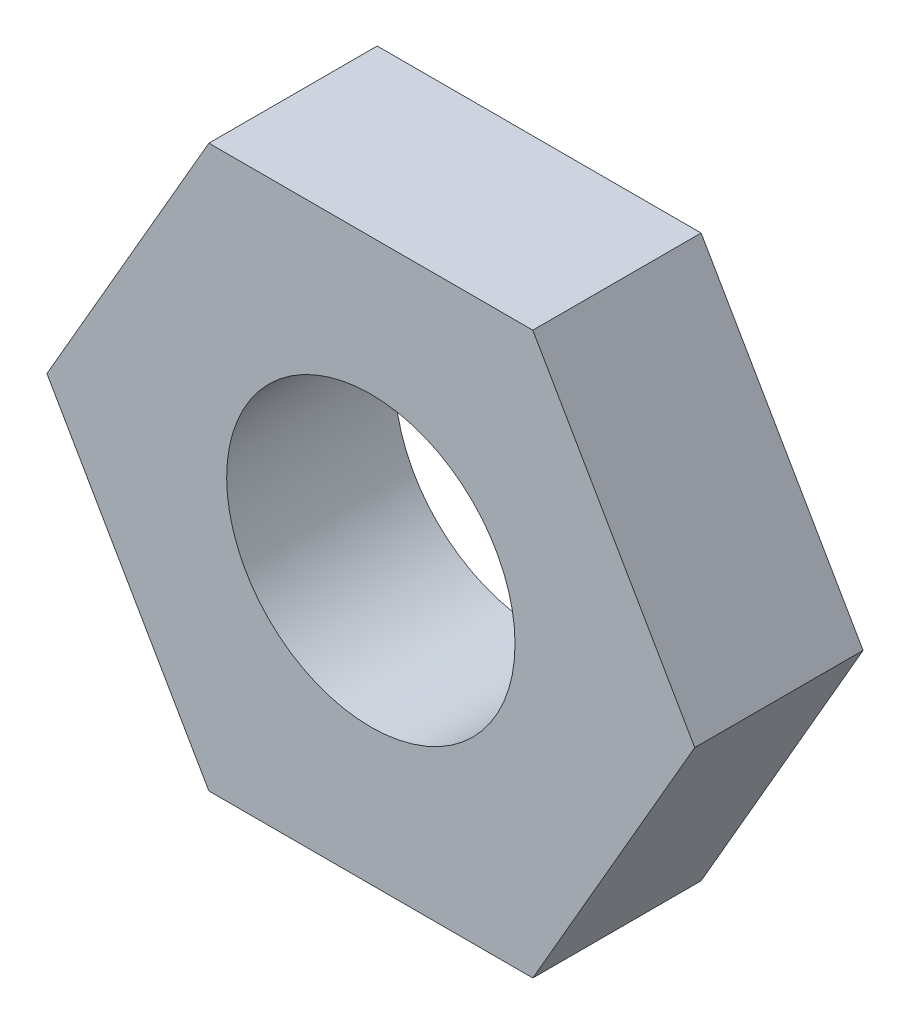
ISO-10303-21;
HEADER;
FILE_DESCRIPTION(('STEP AP214'),'2;1');
FILE_NAME('part.step','',(''),(''),'','','');
FILE_SCHEMA(('AUTOMOTIVE_DESIGN { 1 0 10303 214 1 1 1 1 }'));
ENDSEC;
DATA;
#1=APPLICATION_CONTEXT('core data for automotive mechanical design processes');
#2=APPLICATION_PROTOCOL_DEFINITION('international standard','automotive_design',2000,#1);
#3=PRODUCT_CONTEXT('',#1,'mechanical');
#4=PRODUCT('Part','Part','',(#3));
#5=PRODUCT_RELATED_PRODUCT_CATEGORY('part','',(#4));
#6=PRODUCT_DEFINITION_FORMATION('','',#4);
#7=PRODUCT_DEFINITION_CONTEXT('part definition',#1,'design');
#8=PRODUCT_DEFINITION('design','',#6,#7);
#9=PRODUCT_DEFINITION_SHAPE('','',#8);
#10=(LENGTH_UNIT() NAMED_UNIT(*) SI_UNIT(.MILLI.,.METRE.));
#11=(NAMED_UNIT(*) PLANE_ANGLE_UNIT() SI_UNIT($,.RADIAN.));
#12=(NAMED_UNIT(*) SI_UNIT($,.STERADIAN.) SOLID_ANGLE_UNIT());
#13=UNCERTAINTY_MEASURE_WITH_UNIT(LENGTH_MEASURE(1.E-05),#10,'distance_accuracy_value','');
#14=(GEOMETRIC_REPRESENTATION_CONTEXT(3) GLOBAL_UNCERTAINTY_ASSIGNED_CONTEXT((#13)) GLOBAL_UNIT_ASSIGNED_CONTEXT((#10,
#11,#12)) REPRESENTATION_CONTEXT('',''));
#15=CARTESIAN_POINT('',(0.,0.,0.));
#16=DIRECTION('',(0.,0.,1.));
#17=DIRECTION('',(1.,0.,0.));
#18=AXIS2_PLACEMENT_3D('',#15,#16,#17);
#19=CARTESIAN_POINT('',(3.6661742093542,-6.34999999999996,3.81));
#20=DIRECTION('',(-0.866025403784441,0.499999999999995,0.));
#21=DIRECTION('',(-0.499999999999995,-0.866025403784441,0.));
#22=AXIS2_PLACEMENT_3D('',#19,#20,#21);
#23=PLANE('',#22);
#24=DIRECTION('',(0.499999999999995,0.866025403784441,0.));
#25=VECTOR('',#24,1.);
#26=CARTESIAN_POINT('',(3.6661742093542,-6.34999999999996,0.));
#27=LINE('',#26,#25);
#28=CARTESIAN_POINT('',(3.6661742093542,-6.34999999999996,0.));
#29=VERTEX_POINT('',#28);
#30=CARTESIAN_POINT('',(7.33234841870825,0.,0.));
#31=VERTEX_POINT('',#30);
#32=EDGE_CURVE('E135',#29,#31,#27,.T.);
#33=ORIENTED_EDGE('',*,*,#32,.T.);
#34=DIRECTION('',(0.,0.,-1.));
#35=VECTOR('',#34,1.);
#36=CARTESIAN_POINT('',(7.33234841870825,0.,3.81));
#37=LINE('',#36,#35);
#38=CARTESIAN_POINT('',(7.33234841870825,0.,3.81));
#39=VERTEX_POINT('',#38);
#40=EDGE_CURVE('E11',#39,#31,#37,.T.);
#41=ORIENTED_EDGE('',*,*,#40,.F.);
#42=DIRECTION('',(0.499999999999995,0.866025403784441,0.));
#43=VECTOR('',#42,1.);
#44=CARTESIAN_POINT('',(3.6661742093542,-6.34999999999996,3.81));
#45=LINE('',#44,#43);
#46=CARTESIAN_POINT('',(3.6661742093542,-6.34999999999996,3.81));
#47=VERTEX_POINT('',#46);
#48=EDGE_CURVE('E151',#47,#39,#45,.T.);
#49=ORIENTED_EDGE('',*,*,#48,.F.);
#50=DIRECTION('',(0.,0.,-1.));
#51=VECTOR('',#50,1.);
#52=CARTESIAN_POINT('',(3.6661742093542,-6.34999999999996,3.81));
#53=LINE('',#52,#51);
#54=EDGE_CURVE('E131',#47,#29,#53,.T.);
#55=ORIENTED_EDGE('',*,*,#54,.T.);
#56=EDGE_LOOP('',(#33,#41,#49,#55));
#57=FACE_BOUND('',#56,.T.);
#58=ADVANCED_FACE('F45',(#57),#23,.F.);
#59=CARTESIAN_POINT('',(7.33234841870825,0.,3.81));
#60=DIRECTION('',(-0.866025403784438,-0.500000000000001,0.));
#61=DIRECTION('',(0.500000000000001,-0.866025403784438,0.));
#62=AXIS2_PLACEMENT_3D('',#59,#60,#61);
#63=PLANE('',#62);
#64=DIRECTION('',(-0.500000000000001,0.866025403784438,0.));
#65=VECTOR('',#64,1.);
#66=CARTESIAN_POINT('',(7.33234841870825,0.,0.));
#67=LINE('',#66,#65);
#68=CARTESIAN_POINT('',(3.66617420935411,6.35000000000001,0.));
#69=VERTEX_POINT('',#68);
#70=EDGE_CURVE('E139',#31,#69,#67,.T.);
#71=ORIENTED_EDGE('',*,*,#70,.T.);
#72=DIRECTION('',(0.,0.,-1.));
#73=VECTOR('',#72,1.);
#74=CARTESIAN_POINT('',(3.66617420935411,6.35000000000001,3.81));
#75=LINE('',#74,#73);
#76=CARTESIAN_POINT('',(3.66617420935411,6.35000000000001,3.81));
#77=VERTEX_POINT('',#76);
#78=EDGE_CURVE('E55',#77,#69,#75,.T.);
#79=ORIENTED_EDGE('',*,*,#78,.F.);
#80=DIRECTION('',(-0.500000000000001,0.866025403784438,0.));
#81=VECTOR('',#80,1.);
#82=CARTESIAN_POINT('',(7.33234841870825,0.,3.81));
#83=LINE('',#82,#81);
#84=EDGE_CURVE('E100',#39,#77,#83,.T.);
#85=ORIENTED_EDGE('',*,*,#84,.F.);
#86=ORIENTED_EDGE('',*,*,#40,.T.);
#87=EDGE_LOOP('',(#71,#79,#85,#86));
#88=FACE_BOUND('',#87,.T.);
#89=ADVANCED_FACE('F181',(#88),#63,.F.);
#90=CARTESIAN_POINT('',(3.66617420935411,6.35000000000001,3.81));
#91=DIRECTION('',(0.,-1.,0.));
#92=DIRECTION('',(1.,0.,0.));
#93=AXIS2_PLACEMENT_3D('',#90,#91,#92);
#94=PLANE('',#93);
#95=DIRECTION('',(-1.,0.,0.));
#96=VECTOR('',#95,1.);
#97=CARTESIAN_POINT('',(3.66617420935411,6.35000000000001,0.));
#98=LINE('',#97,#96);
#99=CARTESIAN_POINT('',(-3.66617420935415,6.34999999999999,0.));
#100=VERTEX_POINT('',#99);
#101=EDGE_CURVE('E142',#69,#100,#98,.T.);
#102=ORIENTED_EDGE('',*,*,#101,.T.);
#103=DIRECTION('',(0.,0.,-1.));
#104=VECTOR('',#103,1.);
#105=CARTESIAN_POINT('',(-3.66617420935415,6.34999999999999,3.81));
#106=LINE('',#105,#104);
#107=CARTESIAN_POINT('',(-3.66617420935415,6.34999999999999,3.81));
#108=VERTEX_POINT('',#107);
#109=EDGE_CURVE('E124',#108,#100,#106,.T.);
#110=ORIENTED_EDGE('',*,*,#109,.F.);
#111=DIRECTION('',(-1.,0.,0.));
#112=VECTOR('',#111,1.);
#113=CARTESIAN_POINT('',(3.66617420935411,6.35000000000001,3.81));
#114=LINE('',#113,#112);
#115=EDGE_CURVE('E113',#77,#108,#114,.T.);
#116=ORIENTED_EDGE('',*,*,#115,.F.);
#117=ORIENTED_EDGE('',*,*,#78,.T.);
#118=EDGE_LOOP('',(#102,#110,#116,#117));
#119=FACE_BOUND('',#118,.T.);
#120=ADVANCED_FACE('F162',(#119),#94,.F.);
#121=CARTESIAN_POINT('',(-3.66617420935415,6.34999999999999,3.81));
#122=DIRECTION('',(0.866025403784441,-0.499999999999995,0.));
#123=DIRECTION('',(0.499999999999995,0.866025403784442,0.));
#124=AXIS2_PLACEMENT_3D('',#121,#122,#123);
#125=PLANE('',#124);
#126=DIRECTION('',(-0.499999999999995,-0.866025403784442,0.));
#127=VECTOR('',#126,1.);
#128=CARTESIAN_POINT('',(-3.66617420935415,6.34999999999999,0.));
#129=LINE('',#128,#127);
#130=CARTESIAN_POINT('',(-7.33234841870825,0.,0.));
#131=VERTEX_POINT('',#130);
#132=EDGE_CURVE('E122',#100,#131,#129,.T.);
#133=ORIENTED_EDGE('',*,*,#132,.T.);
#134=DIRECTION('',(0.,0.,-1.));
#135=VECTOR('',#134,1.);
#136=CARTESIAN_POINT('',(-7.33234841870825,0.,3.81));
#137=LINE('',#136,#135);
#138=CARTESIAN_POINT('',(-7.33234841870825,0.,3.81));
#139=VERTEX_POINT('',#138);
#140=EDGE_CURVE('E119',#139,#131,#137,.T.);
#141=ORIENTED_EDGE('',*,*,#140,.F.);
#142=DIRECTION('',(-0.499999999999995,-0.866025403784442,0.));
#143=VECTOR('',#142,1.);
#144=CARTESIAN_POINT('',(-3.66617420935415,6.34999999999999,3.81));
#145=LINE('',#144,#143);
#146=EDGE_CURVE('E107',#108,#139,#145,.T.);
#147=ORIENTED_EDGE('',*,*,#146,.F.);
#148=ORIENTED_EDGE('',*,*,#109,.T.);
#149=EDGE_LOOP('',(#133,#141,#147,#148));
#150=FACE_BOUND('',#149,.T.);
#151=ADVANCED_FACE('F120',(#150),#125,.F.);
#152=CARTESIAN_POINT('',(-7.33234841870825,0.,3.81));
#153=DIRECTION('',(0.866025403784435,0.500000000000007,0.));
#154=DIRECTION('',(-0.500000000000007,0.866025403784435,0.));
#155=AXIS2_PLACEMENT_3D('',#152,#153,#154);
#156=PLANE('',#155);
#157=DIRECTION('',(0.500000000000007,-0.866025403784435,0.));
#158=VECTOR('',#157,1.);
#159=CARTESIAN_POINT('',(-7.33234841870825,0.,0.));
#160=LINE('',#159,#158);
#161=CARTESIAN_POINT('',(-3.66617420935407,-6.35000000000004,0.));
#162=VERTEX_POINT('',#161);
#163=EDGE_CURVE('E86',#131,#162,#160,.T.);
#164=ORIENTED_EDGE('',*,*,#163,.T.);
#165=DIRECTION('',(0.,0.,-1.));
#166=VECTOR('',#165,1.);
#167=CARTESIAN_POINT('',(-3.66617420935407,-6.35000000000004,3.81));
#168=LINE('',#167,#166);
#169=CARTESIAN_POINT('',(-3.66617420935407,-6.35000000000004,3.81));
#170=VERTEX_POINT('',#169);
#171=EDGE_CURVE('E125',#170,#162,#168,.T.);
#172=ORIENTED_EDGE('',*,*,#171,.F.);
#173=DIRECTION('',(0.500000000000007,-0.866025403784435,0.));
#174=VECTOR('',#173,1.);
#175=CARTESIAN_POINT('',(-7.33234841870825,0.,3.81));
#176=LINE('',#175,#174);
#177=EDGE_CURVE('E111',#139,#170,#176,.T.);
#178=ORIENTED_EDGE('',*,*,#177,.F.);
#179=ORIENTED_EDGE('',*,*,#140,.T.);
#180=EDGE_LOOP('',(#164,#172,#178,#179));
#181=FACE_BOUND('',#180,.T.);
#182=ADVANCED_FACE('F127',(#181),#156,.F.);
#183=CARTESIAN_POINT('',(-3.66617420935407,-6.35000000000004,3.81));
#184=DIRECTION('',(0.,1.,0.));
#185=DIRECTION('',(-1.,0.,0.));
#186=AXIS2_PLACEMENT_3D('',#183,#184,#185);
#187=PLANE('',#186);
#188=DIRECTION('',(1.,0.,0.));
#189=VECTOR('',#188,1.);
#190=CARTESIAN_POINT('',(-3.66617420935407,-6.35000000000004,0.));
#191=LINE('',#190,#189);
#192=EDGE_CURVE('E92',#162,#29,#191,.T.);
#193=ORIENTED_EDGE('',*,*,#192,.T.);
#194=ORIENTED_EDGE('',*,*,#54,.F.);
#195=DIRECTION('',(1.,0.,0.));
#196=VECTOR('',#195,1.);
#197=CARTESIAN_POINT('',(-3.66617420935407,-6.35000000000004,3.81));
#198=LINE('',#197,#196);
#199=EDGE_CURVE('E63',#170,#47,#198,.T.);
#200=ORIENTED_EDGE('',*,*,#199,.F.);
#201=ORIENTED_EDGE('',*,*,#171,.T.);
#202=EDGE_LOOP('',(#193,#194,#200,#201));
#203=FACE_BOUND('',#202,.T.);
#204=ADVANCED_FACE('F169',(#203),#187,.F.);
#205=CARTESIAN_POINT('',(0.,0.,3.81));
#206=DIRECTION('',(0.,0.,1.));
#207=DIRECTION('',(1.,0.,0.));
#208=AXIS2_PLACEMENT_3D('',#205,#206,#207);
#209=PLANE('',#208);
#210=CARTESIAN_POINT('',(0.,0.,3.81));
#211=DIRECTION('',(0.,0.,1.));
#212=DIRECTION('',(1.,0.,0.));
#213=AXIS2_PLACEMENT_3D('',#210,#211,#212);
#214=CIRCLE('',#213,3.2639);
#215=CARTESIAN_POINT('',(3.2639,0.,3.81));
#216=VERTEX_POINT('',#215);
#217=EDGE_CURVE('E235',#216,#216,#214,.T.);
#218=ORIENTED_EDGE('',*,*,#217,.F.);
#219=EDGE_LOOP('',(#218));
#220=FACE_BOUND('',#219,.T.);
#221=ORIENTED_EDGE('',*,*,#48,.T.);
#222=ORIENTED_EDGE('',*,*,#84,.T.);
#223=ORIENTED_EDGE('',*,*,#115,.T.);
#224=ORIENTED_EDGE('',*,*,#146,.T.);
#225=ORIENTED_EDGE('',*,*,#177,.T.);
#226=ORIENTED_EDGE('',*,*,#199,.T.);
#227=EDGE_LOOP('',(#221,#222,#223,#224,#225,#226));
#228=FACE_BOUND('',#227,.T.);
#229=ADVANCED_FACE('F109',(#220,#228),#209,.T.);
#230=CARTESIAN_POINT('',(0.,0.,0.));
#231=DIRECTION('',(0.,0.,1.));
#232=DIRECTION('',(1.,0.,0.));
#233=AXIS2_PLACEMENT_3D('',#230,#231,#232);
#234=PLANE('',#233);
#235=CARTESIAN_POINT('',(0.,0.,0.));
#236=DIRECTION('',(0.,0.,1.));
#237=DIRECTION('',(1.,0.,0.));
#238=AXIS2_PLACEMENT_3D('',#235,#236,#237);
#239=CIRCLE('',#238,3.2639);
#240=CARTESIAN_POINT('',(3.2639,0.,0.));
#241=VERTEX_POINT('',#240);
#242=EDGE_CURVE('E48',#241,#241,#239,.T.);
#243=ORIENTED_EDGE('',*,*,#242,.T.);
#244=EDGE_LOOP('',(#243));
#245=FACE_BOUND('',#244,.T.);
#246=ORIENTED_EDGE('',*,*,#32,.F.);
#247=ORIENTED_EDGE('',*,*,#192,.F.);
#248=ORIENTED_EDGE('',*,*,#163,.F.);
#249=ORIENTED_EDGE('',*,*,#132,.F.);
#250=ORIENTED_EDGE('',*,*,#101,.F.);
#251=ORIENTED_EDGE('',*,*,#70,.F.);
#252=EDGE_LOOP('',(#246,#247,#248,#249,#250,#251));
#253=FACE_BOUND('',#252,.T.);
#254=ADVANCED_FACE('F165',(#245,#253),#234,.F.);
#255=CARTESIAN_POINT('',(0.,0.,3.81));
#256=DIRECTION('',(0.,0.,1.));
#257=DIRECTION('',(1.,0.,0.));
#258=AXIS2_PLACEMENT_3D('',#255,#256,#257);
#259=CYLINDRICAL_SURFACE('',#258,3.2639);
#260=ORIENTED_EDGE('',*,*,#217,.T.);
#261=EDGE_LOOP('',(#260));
#262=FACE_BOUND('',#261,.T.);
#263=ORIENTED_EDGE('',*,*,#242,.F.);
#264=EDGE_LOOP('',(#263));
#265=FACE_BOUND('',#264,.T.);
#266=ADVANCED_FACE('F220',(#262,#265),#259,.F.);
#267=CLOSED_SHELL('',(#58,#89,#120,#151,#182,#204,#229,#254,#266));
#268=MANIFOLD_SOLID_BREP('B2',#267);
#269=ADVANCED_BREP_SHAPE_REPRESENTATION('',(#18,#268),#14);
#270=SHAPE_DEFINITION_REPRESENTATION(#9,#269);
ENDSEC;
END-ISO-10303-21;
